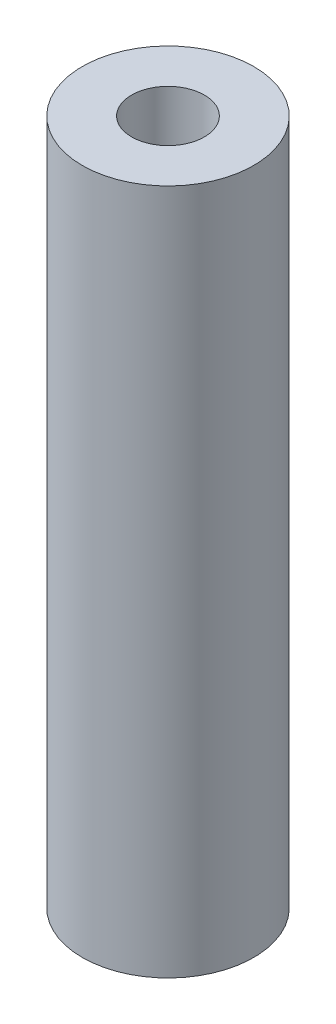
ISO-10303-21;
HEADER;
FILE_DESCRIPTION(('STEP AP214'),'2;1');
FILE_NAME('part.step','',(''),(''),'','','');
FILE_SCHEMA(('AUTOMOTIVE_DESIGN { 1 0 10303 214 1 1 1 1 }'));
ENDSEC;
DATA;
#1=APPLICATION_CONTEXT('core data for automotive mechanical design processes');
#2=APPLICATION_PROTOCOL_DEFINITION('international standard','automotive_design',2000,#1);
#3=PRODUCT_CONTEXT('',#1,'mechanical');
#4=PRODUCT('Part','Part','',(#3));
#5=PRODUCT_RELATED_PRODUCT_CATEGORY('part','',(#4));
#6=PRODUCT_DEFINITION_FORMATION('','',#4);
#7=PRODUCT_DEFINITION_CONTEXT('part definition',#1,'design');
#8=PRODUCT_DEFINITION('design','',#6,#7);
#9=PRODUCT_DEFINITION_SHAPE('','',#8);
#10=(LENGTH_UNIT() NAMED_UNIT(*) SI_UNIT(.MILLI.,.METRE.));
#11=(NAMED_UNIT(*) PLANE_ANGLE_UNIT() SI_UNIT($,.RADIAN.));
#12=(NAMED_UNIT(*) SI_UNIT($,.STERADIAN.) SOLID_ANGLE_UNIT());
#13=UNCERTAINTY_MEASURE_WITH_UNIT(LENGTH_MEASURE(1.E-05),#10,'distance_accuracy_value','');
#14=(GEOMETRIC_REPRESENTATION_CONTEXT(3) GLOBAL_UNCERTAINTY_ASSIGNED_CONTEXT((#13)) GLOBAL_UNIT_ASSIGNED_CONTEXT((#10,
#11,#12)) REPRESENTATION_CONTEXT('',''));
#15=CARTESIAN_POINT('',(0.,0.,0.));
#16=DIRECTION('',(0.,0.,1.));
#17=DIRECTION('',(1.,0.,0.));
#18=AXIS2_PLACEMENT_3D('',#15,#16,#17);
#19=CARTESIAN_POINT('',(0.,38.1,0.));
#20=DIRECTION('',(0.,1.,0.));
#21=DIRECTION('',(0.,0.,1.));
#22=AXIS2_PLACEMENT_3D('',#19,#20,#21);
#23=PLANE('',#22);
#24=CARTESIAN_POINT('',(0.,38.1,0.));
#25=DIRECTION('',(0.,1.,0.));
#26=DIRECTION('',(0.,0.,1.));
#27=AXIS2_PLACEMENT_3D('',#24,#25,#26);
#28=CIRCLE('',#27,4.7625);
#29=CARTESIAN_POINT('',(0.,38.1,4.7625));
#30=VERTEX_POINT('',#29);
#31=EDGE_CURVE('E10',#30,#30,#28,.T.);
#32=ORIENTED_EDGE('',*,*,#31,.T.);
#33=EDGE_LOOP('',(#32));
#34=FACE_BOUND('',#33,.T.);
#35=CARTESIAN_POINT('',(0.,38.1,0.));
#36=DIRECTION('',(0.,1.,0.));
#37=DIRECTION('',(0.,0.,1.));
#38=AXIS2_PLACEMENT_3D('',#35,#36,#37);
#39=CIRCLE('',#38,2.0193);
#40=CARTESIAN_POINT('',(0.,38.1,2.0193));
#41=VERTEX_POINT('',#40);
#42=EDGE_CURVE('E42',#41,#41,#39,.T.);
#43=ORIENTED_EDGE('',*,*,#42,.F.);
#44=EDGE_LOOP('',(#43));
#45=FACE_BOUND('',#44,.T.);
#46=ADVANCED_FACE('F31',(#34,#45),#23,.T.);
#47=CARTESIAN_POINT('',(0.,0.,0.));
#48=DIRECTION('',(0.,1.,0.));
#49=DIRECTION('',(0.,0.,1.));
#50=AXIS2_PLACEMENT_3D('',#47,#48,#49);
#51=PLANE('',#50);
#52=CARTESIAN_POINT('',(0.,0.,0.));
#53=DIRECTION('',(0.,1.,0.));
#54=DIRECTION('',(0.,0.,1.));
#55=AXIS2_PLACEMENT_3D('',#52,#53,#54);
#56=CIRCLE('',#55,4.7625);
#57=CARTESIAN_POINT('',(0.,0.,4.7625));
#58=VERTEX_POINT('',#57);
#59=EDGE_CURVE('E35',#58,#58,#56,.T.);
#60=ORIENTED_EDGE('',*,*,#59,.F.);
#61=EDGE_LOOP('',(#60));
#62=FACE_BOUND('',#61,.T.);
#63=CARTESIAN_POINT('',(0.,0.,0.));
#64=DIRECTION('',(0.,1.,0.));
#65=DIRECTION('',(0.,0.,1.));
#66=AXIS2_PLACEMENT_3D('',#63,#64,#65);
#67=CIRCLE('',#66,2.0193);
#68=CARTESIAN_POINT('',(0.,0.,2.0193));
#69=VERTEX_POINT('',#68);
#70=EDGE_CURVE('E44',#69,#69,#67,.T.);
#71=ORIENTED_EDGE('',*,*,#70,.T.);
#72=EDGE_LOOP('',(#71));
#73=FACE_BOUND('',#72,.T.);
#74=ADVANCED_FACE('F54',(#62,#73),#51,.F.);
#75=CARTESIAN_POINT('',(0.,38.1,0.));
#76=DIRECTION('',(0.,-1.,0.));
#77=DIRECTION('',(0.,0.,-1.));
#78=AXIS2_PLACEMENT_3D('',#75,#76,#77);
#79=CYLINDRICAL_SURFACE('',#78,4.7625);
#80=ORIENTED_EDGE('',*,*,#31,.F.);
#81=EDGE_LOOP('',(#80));
#82=FACE_BOUND('',#81,.T.);
#83=ORIENTED_EDGE('',*,*,#59,.T.);
#84=EDGE_LOOP('',(#83));
#85=FACE_BOUND('',#84,.T.);
#86=ADVANCED_FACE('F33',(#82,#85),#79,.T.);
#87=CARTESIAN_POINT('',(0.,38.1,0.));
#88=DIRECTION('',(0.,-1.,0.));
#89=DIRECTION('',(0.,0.,-1.));
#90=AXIS2_PLACEMENT_3D('',#87,#88,#89);
#91=CYLINDRICAL_SURFACE('',#90,2.0193);
#92=ORIENTED_EDGE('',*,*,#42,.T.);
#93=EDGE_LOOP('',(#92));
#94=FACE_BOUND('',#93,.T.);
#95=ORIENTED_EDGE('',*,*,#70,.F.);
#96=EDGE_LOOP('',(#95));
#97=FACE_BOUND('',#96,.T.);
#98=ADVANCED_FACE('F50',(#94,#97),#91,.F.);
#99=CLOSED_SHELL('',(#46,#74,#86,#98));
#100=MANIFOLD_SOLID_BREP('B2',#99);
#101=ADVANCED_BREP_SHAPE_REPRESENTATION('',(#18,#100),#14);
#102=SHAPE_DEFINITION_REPRESENTATION(#9,#101);
ENDSEC;
END-ISO-10303-21;
